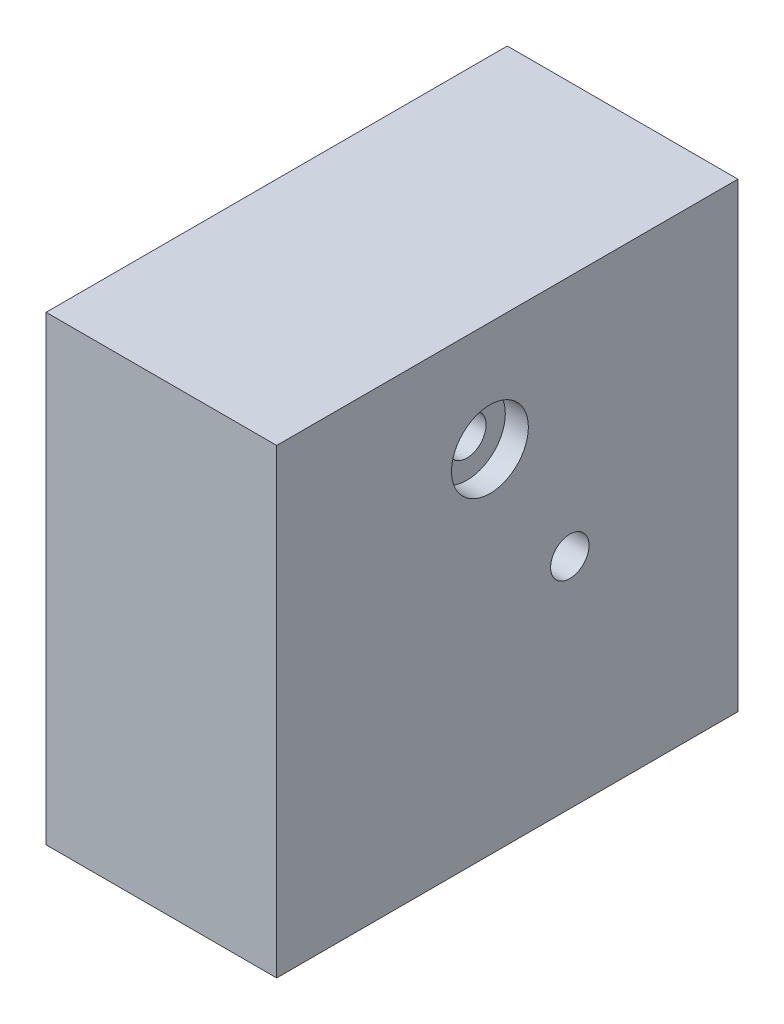
ISO-10303-21;
HEADER;
FILE_DESCRIPTION(('STEP AP214'),'2;1');
FILE_NAME('part.step','',(''),(''),'','','');
FILE_SCHEMA(('AUTOMOTIVE_DESIGN { 1 0 10303 214 1 1 1 1 }'));
ENDSEC;
DATA;
#1=APPLICATION_CONTEXT('core data for automotive mechanical design processes');
#2=APPLICATION_PROTOCOL_DEFINITION('international standard','automotive_design',2000,#1);
#3=PRODUCT_CONTEXT('',#1,'mechanical');
#4=PRODUCT('Part','Part','',(#3));
#5=PRODUCT_RELATED_PRODUCT_CATEGORY('part','',(#4));
#6=PRODUCT_DEFINITION_FORMATION('','',#4);
#7=PRODUCT_DEFINITION_CONTEXT('part definition',#1,'design');
#8=PRODUCT_DEFINITION('design','',#6,#7);
#9=PRODUCT_DEFINITION_SHAPE('','',#8);
#10=(LENGTH_UNIT() NAMED_UNIT(*) SI_UNIT(.MILLI.,.METRE.));
#11=(NAMED_UNIT(*) PLANE_ANGLE_UNIT() SI_UNIT($,.RADIAN.));
#12=(NAMED_UNIT(*) SI_UNIT($,.STERADIAN.) SOLID_ANGLE_UNIT());
#13=UNCERTAINTY_MEASURE_WITH_UNIT(LENGTH_MEASURE(1.E-05),#10,'distance_accuracy_value','');
#14=(GEOMETRIC_REPRESENTATION_CONTEXT(3) GLOBAL_UNCERTAINTY_ASSIGNED_CONTEXT((#13)) GLOBAL_UNIT_ASSIGNED_CONTEXT((#10,
#11,#12)) REPRESENTATION_CONTEXT('',''));
#15=CARTESIAN_POINT('',(0.,0.,0.));
#16=DIRECTION('',(0.,0.,1.));
#17=DIRECTION('',(1.,0.,0.));
#18=AXIS2_PLACEMENT_3D('',#15,#16,#17);
#19=CARTESIAN_POINT('',(-1.2E-05,85.7051553940905,122.259205921495));
#20=DIRECTION('',(1.,0.,0.));
#21=DIRECTION('',(0.,0.,-1.));
#22=AXIS2_PLACEMENT_3D('',#19,#20,#21);
#23=CYLINDRICAL_SURFACE('',#22,2.50000000000001);
#24=CARTESIAN_POINT('',(0.,85.7051553940905,122.259205921495));
#25=DIRECTION('',(1.,0.,0.));
#26=DIRECTION('',(0.,0.,-1.));
#27=AXIS2_PLACEMENT_3D('',#24,#25,#26);
#28=CIRCLE('',#27,2.50000000000001);
#29=CARTESIAN_POINT('',(0.,85.7051553940905,119.759205921495));
#30=VERTEX_POINT('',#29);
#31=EDGE_CURVE('E107',#30,#30,#28,.T.);
#32=CARTESIAN_POINT('',(27.,85.7051553940905,122.259205921495));
#33=DIRECTION('',(1.,0.,0.));
#34=DIRECTION('',(0.,0.,-1.));
#35=AXIS2_PLACEMENT_3D('',#32,#33,#34);
#36=CIRCLE('',#35,2.50000000000001);
#37=CARTESIAN_POINT('',(27.,85.7051553940905,119.759205921495));
#38=VERTEX_POINT('',#37);
#39=EDGE_CURVE('E41',#38,#38,#36,.F.);
#40=CARTESIAN_POINT('',(0.,85.7051553940905,119.759205921495));
#41=CARTESIAN_POINT('',(0.28125,85.7051553940905,119.759205921495));
#42=CARTESIAN_POINT('',(0.5625,85.7051553940905,119.759205921495));
#43=CARTESIAN_POINT('',(1.125,85.7051553940905,119.759205921495));
#44=CARTESIAN_POINT('',(1.40625,85.7051553940905,119.759205921495));
#45=CARTESIAN_POINT('',(1.96875,85.7051553940905,119.759205921495));
#46=CARTESIAN_POINT('',(2.25,85.7051553940905,119.759205921495));
#47=CARTESIAN_POINT('',(2.8125,85.7051553940905,119.759205921495));
#48=CARTESIAN_POINT('',(3.09375,85.7051553940905,119.759205921495));
#49=CARTESIAN_POINT('',(3.65625,85.7051553940905,119.759205921495));
#50=CARTESIAN_POINT('',(3.9375,85.7051553940905,119.759205921495));
#51=CARTESIAN_POINT('',(4.5,85.7051553940905,119.759205921495));
#52=CARTESIAN_POINT('',(4.78125,85.7051553940905,119.759205921495));
#53=CARTESIAN_POINT('',(5.34375,85.7051553940905,119.759205921495));
#54=CARTESIAN_POINT('',(5.625,85.7051553940905,119.759205921495));
#55=CARTESIAN_POINT('',(6.1875,85.7051553940905,119.759205921495));
#56=CARTESIAN_POINT('',(6.46875,85.7051553940905,119.759205921495));
#57=CARTESIAN_POINT('',(7.03125,85.7051553940905,119.759205921495));
#58=CARTESIAN_POINT('',(7.3125,85.7051553940905,119.759205921495));
#59=CARTESIAN_POINT('',(7.875,85.7051553940905,119.759205921495));
#60=CARTESIAN_POINT('',(8.15625,85.7051553940905,119.759205921495));
#61=CARTESIAN_POINT('',(8.71875,85.7051553940905,119.759205921495));
#62=CARTESIAN_POINT('',(9.,85.7051553940905,119.759205921495));
#63=CARTESIAN_POINT('',(9.5625,85.7051553940905,119.759205921495));
#64=CARTESIAN_POINT('',(9.84375,85.7051553940905,119.759205921495));
#65=CARTESIAN_POINT('',(10.40625,85.7051553940905,119.759205921495));
#66=CARTESIAN_POINT('',(10.6875,85.7051553940905,119.759205921495));
#67=CARTESIAN_POINT('',(11.25,85.7051553940905,119.759205921495));
#68=CARTESIAN_POINT('',(11.53125,85.7051553940905,119.759205921495));
#69=CARTESIAN_POINT('',(12.09375,85.7051553940905,119.759205921495));
#70=CARTESIAN_POINT('',(12.375,85.7051553940905,119.759205921495));
#71=CARTESIAN_POINT('',(12.9375,85.7051553940905,119.759205921495));
#72=CARTESIAN_POINT('',(13.21875,85.7051553940905,119.759205921495));
#73=CARTESIAN_POINT('',(13.78125,85.7051553940905,119.759205921495));
#74=CARTESIAN_POINT('',(14.0625,85.7051553940905,119.759205921495));
#75=CARTESIAN_POINT('',(14.625,85.7051553940905,119.759205921495));
#76=CARTESIAN_POINT('',(14.90625,85.7051553940905,119.759205921495));
#77=CARTESIAN_POINT('',(15.46875,85.7051553940905,119.759205921495));
#78=CARTESIAN_POINT('',(15.75,85.7051553940905,119.759205921495));
#79=CARTESIAN_POINT('',(16.3125,85.7051553940905,119.759205921495));
#80=CARTESIAN_POINT('',(16.59375,85.7051553940905,119.759205921495));
#81=CARTESIAN_POINT('',(17.15625,85.7051553940905,119.759205921495));
#82=CARTESIAN_POINT('',(17.4375,85.7051553940905,119.759205921495));
#83=CARTESIAN_POINT('',(18.,85.7051553940905,119.759205921495));
#84=CARTESIAN_POINT('',(18.28125,85.7051553940905,119.759205921495));
#85=CARTESIAN_POINT('',(18.84375,85.7051553940905,119.759205921495));
#86=CARTESIAN_POINT('',(19.125,85.7051553940905,119.759205921495));
#87=CARTESIAN_POINT('',(19.6875,85.7051553940905,119.759205921495));
#88=CARTESIAN_POINT('',(19.96875,85.7051553940905,119.759205921495));
#89=CARTESIAN_POINT('',(20.53125,85.7051553940905,119.759205921495));
#90=CARTESIAN_POINT('',(20.8125,85.7051553940905,119.759205921495));
#91=CARTESIAN_POINT('',(21.375,85.7051553940905,119.759205921495));
#92=CARTESIAN_POINT('',(21.65625,85.7051553940905,119.759205921495));
#93=CARTESIAN_POINT('',(22.21875,85.7051553940905,119.759205921495));
#94=CARTESIAN_POINT('',(22.5,85.7051553940905,119.759205921495));
#95=CARTESIAN_POINT('',(23.0625,85.7051553940905,119.759205921495));
#96=CARTESIAN_POINT('',(23.34375,85.7051553940905,119.759205921495));
#97=CARTESIAN_POINT('',(23.90625,85.7051553940905,119.759205921495));
#98=CARTESIAN_POINT('',(24.1875,85.7051553940905,119.759205921495));
#99=CARTESIAN_POINT('',(24.75,85.7051553940905,119.759205921495));
#100=CARTESIAN_POINT('',(25.03125,85.7051553940905,119.759205921495));
#101=CARTESIAN_POINT('',(25.59375,85.7051553940905,119.759205921495));
#102=CARTESIAN_POINT('',(25.875,85.7051553940905,119.759205921495));
#103=CARTESIAN_POINT('',(26.4375,85.7051553940905,119.759205921495));
#104=CARTESIAN_POINT('',(26.71875,85.7051553940905,119.759205921495));
#105=CARTESIAN_POINT('',(27.,85.7051553940905,119.759205921495));
#106=B_SPLINE_CURVE_WITH_KNOTS('',3,(#40,#41,#42,#43,#44,#45,#46,#47,#48,#49,#50,#51,#52,#53,
#54,#55,#56,#57,#58,#59,#60,#61,#62,#63,#64,#65,#66,#67,#68,#69,#70,#71,#72,#73,#74,#75,#76,#77,
#78,#79,#80,#81,#82,#83,#84,#85,#86,#87,#88,#89,#90,#91,#92,#93,#94,#95,#96,#97,#98,#99,#100,
#101,#102,#103,#104,#105),.UNSPECIFIED.,.F.,.F.,(4,2,2,2,2,2,2,2,2,2,2,2,2,2,2,2,2,2,2,2,2,2,2,
2,2,2,2,2,2,2,2,2,4),(0.,0.84375,1.6875,2.53125,3.375,4.21875,5.0625,5.90625,6.75,7.59375,
8.4375,9.28125,10.125,10.96875,11.8125,12.65625,13.5,14.34375,15.1875,16.03125,16.875,17.71875,
18.5625,19.40625,20.25,21.09375,21.9375,22.78125,23.625,24.46875,25.3125,26.15625,27.),.UNSPECIFIED.);
#107=EDGE_CURVE('BSEAM37',#30,#38,#106,.T.);
#108=ORIENTED_EDGE('',*,*,#31,.F.);
#109=ORIENTED_EDGE('',*,*,#39,.F.);
#110=ORIENTED_EDGE('',*,*,#107,.T.);
#111=ORIENTED_EDGE('',*,*,#107,.F.);
#112=EDGE_LOOP('',(#108,#110,#109,#111));
#113=FACE_BOUND('',#112,.T.);
#114=ADVANCED_FACE('F37',(#113),#23,.F.);
#115=CARTESIAN_POINT('',(-1.2E-05,68.4373066352128,111.869519883621));
#116=DIRECTION('',(1.,0.,0.));
#117=DIRECTION('',(0.,0.,-1.));
#118=AXIS2_PLACEMENT_3D('',#115,#116,#117);
#119=CYLINDRICAL_SURFACE('',#118,2.5);
#120=CARTESIAN_POINT('',(30.,68.4373066352128,111.869519883621));
#121=DIRECTION('',(1.,0.,0.));
#122=DIRECTION('',(0.,0.,-1.));
#123=AXIS2_PLACEMENT_3D('',#120,#121,#122);
#124=CIRCLE('',#123,2.5);
#125=CARTESIAN_POINT('',(30.,68.4373066352128,109.369519883621));
#126=VERTEX_POINT('',#125);
#127=EDGE_CURVE('E114',#126,#126,#124,.T.);
#128=CARTESIAN_POINT('',(3.,68.4373066352128,111.869519883621));
#129=DIRECTION('',(-1.,0.,0.));
#130=DIRECTION('',(0.,0.,1.));
#131=AXIS2_PLACEMENT_3D('',#128,#129,#130);
#132=CIRCLE('',#131,2.5);
#133=CARTESIAN_POINT('',(3.,68.4373066352128,109.369519883621));
#134=VERTEX_POINT('',#133);
#135=EDGE_CURVE('E115',#134,#134,#132,.F.);
#136=CARTESIAN_POINT('',(30.,68.4373066352128,109.369519883621));
#137=CARTESIAN_POINT('',(29.71875,68.4373066352128,109.369519883621));
#138=CARTESIAN_POINT('',(29.4375,68.4373066352128,109.369519883621));
#139=CARTESIAN_POINT('',(28.875,68.4373066352128,109.369519883621));
#140=CARTESIAN_POINT('',(28.59375,68.4373066352128,109.369519883621));
#141=CARTESIAN_POINT('',(28.03125,68.4373066352128,109.369519883621));
#142=CARTESIAN_POINT('',(27.75,68.4373066352128,109.369519883621));
#143=CARTESIAN_POINT('',(27.1875,68.4373066352128,109.369519883621));
#144=CARTESIAN_POINT('',(26.90625,68.4373066352128,109.369519883621));
#145=CARTESIAN_POINT('',(26.34375,68.4373066352128,109.369519883621));
#146=CARTESIAN_POINT('',(26.0625,68.4373066352128,109.369519883621));
#147=CARTESIAN_POINT('',(25.5,68.4373066352128,109.369519883621));
#148=CARTESIAN_POINT('',(25.21875,68.4373066352128,109.369519883621));
#149=CARTESIAN_POINT('',(24.65625,68.4373066352128,109.369519883621));
#150=CARTESIAN_POINT('',(24.375,68.4373066352128,109.369519883621));
#151=CARTESIAN_POINT('',(23.8125,68.4373066352128,109.369519883621));
#152=CARTESIAN_POINT('',(23.53125,68.4373066352128,109.369519883621));
#153=CARTESIAN_POINT('',(22.96875,68.4373066352128,109.369519883621));
#154=CARTESIAN_POINT('',(22.6875,68.4373066352128,109.369519883621));
#155=CARTESIAN_POINT('',(22.125,68.4373066352128,109.369519883621));
#156=CARTESIAN_POINT('',(21.84375,68.4373066352128,109.369519883621));
#157=CARTESIAN_POINT('',(21.28125,68.4373066352128,109.369519883621));
#158=CARTESIAN_POINT('',(21.,68.4373066352128,109.369519883621));
#159=CARTESIAN_POINT('',(20.4375,68.4373066352128,109.369519883621));
#160=CARTESIAN_POINT('',(20.15625,68.4373066352128,109.369519883621));
#161=CARTESIAN_POINT('',(19.59375,68.4373066352128,109.369519883621));
#162=CARTESIAN_POINT('',(19.3125,68.4373066352128,109.369519883621));
#163=CARTESIAN_POINT('',(18.75,68.4373066352128,109.369519883621));
#164=CARTESIAN_POINT('',(18.46875,68.4373066352128,109.369519883621));
#165=CARTESIAN_POINT('',(17.90625,68.4373066352128,109.369519883621));
#166=CARTESIAN_POINT('',(17.625,68.4373066352128,109.369519883621));
#167=CARTESIAN_POINT('',(17.0625,68.4373066352128,109.369519883621));
#168=CARTESIAN_POINT('',(16.78125,68.4373066352128,109.369519883621));
#169=CARTESIAN_POINT('',(16.21875,68.4373066352128,109.369519883621));
#170=CARTESIAN_POINT('',(15.9375,68.4373066352128,109.369519883621));
#171=CARTESIAN_POINT('',(15.375,68.4373066352128,109.369519883621));
#172=CARTESIAN_POINT('',(15.09375,68.4373066352128,109.369519883621));
#173=CARTESIAN_POINT('',(14.53125,68.4373066352128,109.369519883621));
#174=CARTESIAN_POINT('',(14.25,68.4373066352128,109.369519883621));
#175=CARTESIAN_POINT('',(13.6875,68.4373066352128,109.369519883621));
#176=CARTESIAN_POINT('',(13.40625,68.4373066352128,109.369519883621));
#177=CARTESIAN_POINT('',(12.84375,68.4373066352128,109.369519883621));
#178=CARTESIAN_POINT('',(12.5625,68.4373066352128,109.369519883621));
#179=CARTESIAN_POINT('',(12.,68.4373066352128,109.369519883621));
#180=CARTESIAN_POINT('',(11.71875,68.4373066352128,109.369519883621));
#181=CARTESIAN_POINT('',(11.15625,68.4373066352128,109.369519883621));
#182=CARTESIAN_POINT('',(10.875,68.4373066352128,109.369519883621));
#183=CARTESIAN_POINT('',(10.3125,68.4373066352128,109.369519883621));
#184=CARTESIAN_POINT('',(10.03125,68.4373066352128,109.369519883621));
#185=CARTESIAN_POINT('',(9.46875,68.4373066352128,109.369519883621));
#186=CARTESIAN_POINT('',(9.1875,68.4373066352128,109.369519883621));
#187=CARTESIAN_POINT('',(8.625,68.4373066352128,109.369519883621));
#188=CARTESIAN_POINT('',(8.34375,68.4373066352128,109.369519883621));
#189=CARTESIAN_POINT('',(7.78125,68.4373066352128,109.369519883621));
#190=CARTESIAN_POINT('',(7.5,68.4373066352128,109.369519883621));
#191=CARTESIAN_POINT('',(6.9375,68.4373066352128,109.369519883621));
#192=CARTESIAN_POINT('',(6.65625,68.4373066352128,109.369519883621));
#193=CARTESIAN_POINT('',(6.09375,68.4373066352128,109.369519883621));
#194=CARTESIAN_POINT('',(5.8125,68.4373066352128,109.369519883621));
#195=CARTESIAN_POINT('',(5.25,68.4373066352128,109.369519883621));
#196=CARTESIAN_POINT('',(4.96875,68.4373066352128,109.369519883621));
#197=CARTESIAN_POINT('',(4.40625,68.4373066352128,109.369519883621));
#198=CARTESIAN_POINT('',(4.125,68.4373066352128,109.369519883621));
#199=CARTESIAN_POINT('',(3.5625,68.4373066352128,109.369519883621));
#200=CARTESIAN_POINT('',(3.28125,68.4373066352128,109.369519883621));
#201=CARTESIAN_POINT('',(3.,68.4373066352128,109.369519883621));
#202=B_SPLINE_CURVE_WITH_KNOTS('',3,(#136,#137,#138,#139,#140,#141,#142,#143,#144,#145,#146,
#147,#148,#149,#150,#151,#152,#153,#154,#155,#156,#157,#158,#159,#160,#161,#162,#163,#164,#165,
#166,#167,#168,#169,#170,#171,#172,#173,#174,#175,#176,#177,#178,#179,#180,#181,#182,#183,#184,
#185,#186,#187,#188,#189,#190,#191,#192,#193,#194,#195,#196,#197,#198,#199,#200,#201),
.UNSPECIFIED.,.F.,.F.,(4,2,2,2,2,2,2,2,2,2,2,2,2,2,2,2,2,2,2,2,2,2,2,2,2,2,2,2,2,2,2,2,4),(0.,
0.843750000000001,1.6875,2.53125,3.375,4.21875,5.0625,5.90625,6.75,7.59375,8.4375,9.28125,
10.125,10.96875,11.8125,12.65625,13.5,14.34375,15.1875,16.03125,16.875,17.71875,18.5625,
19.40625,20.25,21.09375,21.9375,22.78125,23.625,24.46875,25.3125,26.15625,27.),.UNSPECIFIED.);
#203=EDGE_CURVE('BSEAM143',#126,#134,#202,.T.);
#204=ORIENTED_EDGE('',*,*,#127,.T.);
#205=ORIENTED_EDGE('',*,*,#135,.F.);
#206=ORIENTED_EDGE('',*,*,#203,.T.);
#207=ORIENTED_EDGE('',*,*,#203,.F.);
#208=EDGE_LOOP('',(#204,#206,#205,#207));
#209=FACE_BOUND('',#208,.T.);
#210=ADVANCED_FACE('F143',(#209),#119,.F.);
#211=CARTESIAN_POINT('',(30.,100.,90.));
#212=DIRECTION('',(0.,-1.,0.));
#213=DIRECTION('',(0.,0.,-1.));
#214=AXIS2_PLACEMENT_3D('',#211,#212,#213);
#215=PLANE('',#214);
#216=DIRECTION('',(0.,0.,1.));
#217=VECTOR('',#216,1.);
#218=CARTESIAN_POINT('',(0.,100.,90.));
#219=LINE('',#218,#217);
#220=CARTESIAN_POINT('',(0.,100.,90.));
#221=VERTEX_POINT('',#220);
#222=CARTESIAN_POINT('',(0.,100.,150.));
#223=VERTEX_POINT('',#222);
#224=EDGE_CURVE('E104',#221,#223,#219,.T.);
#225=ORIENTED_EDGE('',*,*,#224,.T.);
#226=DIRECTION('',(-1.,0.,0.));
#227=VECTOR('',#226,1.);
#228=CARTESIAN_POINT('',(30.,100.,150.));
#229=LINE('',#228,#227);
#230=CARTESIAN_POINT('',(30.,100.,150.));
#231=VERTEX_POINT('',#230);
#232=EDGE_CURVE('E11',#231,#223,#229,.T.);
#233=ORIENTED_EDGE('',*,*,#232,.F.);
#234=DIRECTION('',(0.,0.,1.));
#235=VECTOR('',#234,1.);
#236=CARTESIAN_POINT('',(30.,100.,90.));
#237=LINE('',#236,#235);
#238=CARTESIAN_POINT('',(30.,100.,90.));
#239=VERTEX_POINT('',#238);
#240=EDGE_CURVE('E91',#239,#231,#237,.T.);
#241=ORIENTED_EDGE('',*,*,#240,.F.);
#242=DIRECTION('',(-1.,0.,0.));
#243=VECTOR('',#242,1.);
#244=CARTESIAN_POINT('',(30.,100.,90.));
#245=LINE('',#244,#243);
#246=EDGE_CURVE('E100',#239,#221,#245,.T.);
#247=ORIENTED_EDGE('',*,*,#246,.T.);
#248=EDGE_LOOP('',(#225,#233,#241,#247));
#249=FACE_BOUND('',#248,.T.);
#250=ADVANCED_FACE('F39',(#249),#215,.F.);
#251=CARTESIAN_POINT('',(30.,100.,150.));
#252=DIRECTION('',(0.,0.,-1.));
#253=DIRECTION('',(0.,1.,0.));
#254=AXIS2_PLACEMENT_3D('',#251,#252,#253);
#255=PLANE('',#254);
#256=DIRECTION('',(0.,-1.,0.));
#257=VECTOR('',#256,1.);
#258=CARTESIAN_POINT('',(0.,100.,150.));
#259=LINE('',#258,#257);
#260=CARTESIAN_POINT('',(0.,40.,150.));
#261=VERTEX_POINT('',#260);
#262=EDGE_CURVE('E95',#223,#261,#259,.T.);
#263=ORIENTED_EDGE('',*,*,#262,.T.);
#264=DIRECTION('',(-1.,0.,0.));
#265=VECTOR('',#264,1.);
#266=CARTESIAN_POINT('',(30.,40.,150.));
#267=LINE('',#266,#265);
#268=CARTESIAN_POINT('',(30.,40.,150.));
#269=VERTEX_POINT('',#268);
#270=EDGE_CURVE('E47',#269,#261,#267,.T.);
#271=ORIENTED_EDGE('',*,*,#270,.F.);
#272=DIRECTION('',(0.,-1.,0.));
#273=VECTOR('',#272,1.);
#274=CARTESIAN_POINT('',(30.,100.,150.));
#275=LINE('',#274,#273);
#276=EDGE_CURVE('E86',#231,#269,#275,.T.);
#277=ORIENTED_EDGE('',*,*,#276,.F.);
#278=ORIENTED_EDGE('',*,*,#232,.T.);
#279=EDGE_LOOP('',(#263,#271,#277,#278));
#280=FACE_BOUND('',#279,.T.);
#281=ADVANCED_FACE('F94',(#280),#255,.F.);
#282=CARTESIAN_POINT('',(30.,40.,90.));
#283=DIRECTION('',(0.,1.,0.));
#284=DIRECTION('',(0.,0.,1.));
#285=AXIS2_PLACEMENT_3D('',#282,#283,#284);
#286=PLANE('',#285);
#287=DIRECTION('',(0.,0.,-1.));
#288=VECTOR('',#287,1.);
#289=CARTESIAN_POINT('',(0.,40.,90.));
#290=LINE('',#289,#288);
#291=CARTESIAN_POINT('',(0.,40.,90.));
#292=VERTEX_POINT('',#291);
#293=EDGE_CURVE('E73',#261,#292,#290,.T.);
#294=ORIENTED_EDGE('',*,*,#293,.T.);
#295=DIRECTION('',(-1.,0.,0.));
#296=VECTOR('',#295,1.);
#297=CARTESIAN_POINT('',(30.,40.,90.));
#298=LINE('',#297,#296);
#299=CARTESIAN_POINT('',(30.,40.,90.));
#300=VERTEX_POINT('',#299);
#301=EDGE_CURVE('E96',#300,#292,#298,.T.);
#302=ORIENTED_EDGE('',*,*,#301,.F.);
#303=DIRECTION('',(0.,0.,-1.));
#304=VECTOR('',#303,1.);
#305=CARTESIAN_POINT('',(30.,40.,90.));
#306=LINE('',#305,#304);
#307=EDGE_CURVE('E89',#269,#300,#306,.T.);
#308=ORIENTED_EDGE('',*,*,#307,.F.);
#309=ORIENTED_EDGE('',*,*,#270,.T.);
#310=EDGE_LOOP('',(#294,#302,#308,#309));
#311=FACE_BOUND('',#310,.T.);
#312=ADVANCED_FACE('F98',(#311),#286,.F.);
#313=CARTESIAN_POINT('',(30.,100.,90.));
#314=DIRECTION('',(0.,0.,1.));
#315=DIRECTION('',(0.,-1.,0.));
#316=AXIS2_PLACEMENT_3D('',#313,#314,#315);
#317=PLANE('',#316);
#318=DIRECTION('',(0.,1.,0.));
#319=VECTOR('',#318,1.);
#320=CARTESIAN_POINT('',(0.,100.,90.));
#321=LINE('',#320,#319);
#322=EDGE_CURVE('E79',#292,#221,#321,.T.);
#323=ORIENTED_EDGE('',*,*,#322,.T.);
#324=ORIENTED_EDGE('',*,*,#246,.F.);
#325=DIRECTION('',(0.,1.,0.));
#326=VECTOR('',#325,1.);
#327=CARTESIAN_POINT('',(30.,100.,90.));
#328=LINE('',#327,#326);
#329=EDGE_CURVE('E56',#300,#239,#328,.T.);
#330=ORIENTED_EDGE('',*,*,#329,.F.);
#331=ORIENTED_EDGE('',*,*,#301,.T.);
#332=EDGE_LOOP('',(#323,#324,#330,#331));
#333=FACE_BOUND('',#332,.T.);
#334=ADVANCED_FACE('F157',(#333),#317,.F.);
#335=CARTESIAN_POINT('',(30.,0.,0.));
#336=DIRECTION('',(1.,0.,0.));
#337=DIRECTION('',(0.,0.,-1.));
#338=AXIS2_PLACEMENT_3D('',#335,#336,#337);
#339=PLANE('',#338);
#340=CARTESIAN_POINT('',(30.,85.7051553940905,122.259205921495));
#341=DIRECTION('',(1.,0.,0.));
#342=DIRECTION('',(0.,0.,-1.));
#343=AXIS2_PLACEMENT_3D('',#340,#341,#342);
#344=CIRCLE('',#343,5.00000000000001);
#345=CARTESIAN_POINT('',(30.,85.7051553940905,117.259205921495));
#346=VERTEX_POINT('',#345);
#347=EDGE_CURVE('E130',#346,#346,#344,.T.);
#348=ORIENTED_EDGE('',*,*,#347,.F.);
#349=EDGE_LOOP('',(#348));
#350=FACE_BOUND('',#349,.T.);
#351=ORIENTED_EDGE('',*,*,#127,.F.);
#352=EDGE_LOOP('',(#351));
#353=FACE_BOUND('',#352,.T.);
#354=ORIENTED_EDGE('',*,*,#240,.T.);
#355=ORIENTED_EDGE('',*,*,#276,.T.);
#356=ORIENTED_EDGE('',*,*,#307,.T.);
#357=ORIENTED_EDGE('',*,*,#329,.T.);
#358=EDGE_LOOP('',(#354,#355,#356,#357));
#359=FACE_BOUND('',#358,.T.);
#360=ADVANCED_FACE('F87',(#350,#353,#359),#339,.T.);
#361=CARTESIAN_POINT('',(0.,0.,0.));
#362=DIRECTION('',(1.,0.,0.));
#363=DIRECTION('',(0.,0.,-1.));
#364=AXIS2_PLACEMENT_3D('',#361,#362,#363);
#365=PLANE('',#364);
#366=CARTESIAN_POINT('',(0.,68.4373066352128,111.869519883621));
#367=DIRECTION('',(-1.,0.,0.));
#368=DIRECTION('',(0.,0.,1.));
#369=AXIS2_PLACEMENT_3D('',#366,#367,#368);
#370=CIRCLE('',#369,5.00000000000001);
#371=CARTESIAN_POINT('',(0.,68.4373066352128,116.869519883621));
#372=VERTEX_POINT('',#371);
#373=EDGE_CURVE('E123',#372,#372,#370,.T.);
#374=ORIENTED_EDGE('',*,*,#373,.F.);
#375=EDGE_LOOP('',(#374));
#376=FACE_BOUND('',#375,.T.);
#377=ORIENTED_EDGE('',*,*,#31,.T.);
#378=EDGE_LOOP('',(#377));
#379=FACE_BOUND('',#378,.T.);
#380=ORIENTED_EDGE('',*,*,#224,.F.);
#381=ORIENTED_EDGE('',*,*,#322,.F.);
#382=ORIENTED_EDGE('',*,*,#293,.F.);
#383=ORIENTED_EDGE('',*,*,#262,.F.);
#384=EDGE_LOOP('',(#380,#381,#382,#383));
#385=FACE_BOUND('',#384,.T.);
#386=ADVANCED_FACE('F156',(#376,#379,#385),#365,.F.);
#387=CARTESIAN_POINT('',(3.,68.4373066352128,111.869519883621));
#388=DIRECTION('',(-1.,0.,0.));
#389=DIRECTION('',(0.,0.,1.));
#390=AXIS2_PLACEMENT_3D('',#387,#388,#389);
#391=PLANE('',#390);
#392=CARTESIAN_POINT('',(3.,68.4373066352128,111.869519883621));
#393=DIRECTION('',(-1.,0.,0.));
#394=DIRECTION('',(0.,0.,1.));
#395=AXIS2_PLACEMENT_3D('',#392,#393,#394);
#396=CIRCLE('',#395,5.00000000000001);
#397=CARTESIAN_POINT('',(3.,68.4373066352128,116.869519883621));
#398=VERTEX_POINT('',#397);
#399=EDGE_CURVE('E117',#398,#398,#396,.T.);
#400=ORIENTED_EDGE('',*,*,#399,.T.);
#401=EDGE_LOOP('',(#400));
#402=FACE_BOUND('',#401,.T.);
#403=ORIENTED_EDGE('',*,*,#135,.T.);
#404=EDGE_LOOP('',(#403));
#405=FACE_BOUND('',#404,.T.);
#406=ADVANCED_FACE('F161',(#402,#405),#391,.T.);
#407=CARTESIAN_POINT('',(3.,68.4373066352128,111.869519883621));
#408=DIRECTION('',(-1.,0.,0.));
#409=DIRECTION('',(0.,0.,1.));
#410=AXIS2_PLACEMENT_3D('',#407,#408,#409);
#411=CYLINDRICAL_SURFACE('',#410,5.00000000000001);
#412=ORIENTED_EDGE('',*,*,#399,.F.);
#413=EDGE_LOOP('',(#412));
#414=FACE_BOUND('',#413,.T.);
#415=ORIENTED_EDGE('',*,*,#373,.T.);
#416=EDGE_LOOP('',(#415));
#417=FACE_BOUND('',#416,.T.);
#418=ADVANCED_FACE('F199',(#414,#417),#411,.F.);
#419=CARTESIAN_POINT('',(27.,85.7051553940905,122.259205921495));
#420=DIRECTION('',(1.,0.,0.));
#421=DIRECTION('',(0.,0.,-1.));
#422=AXIS2_PLACEMENT_3D('',#419,#420,#421);
#423=PLANE('',#422);
#424=CARTESIAN_POINT('',(27.,85.7051553940905,122.259205921495));
#425=DIRECTION('',(1.,0.,0.));
#426=DIRECTION('',(0.,0.,-1.));
#427=AXIS2_PLACEMENT_3D('',#424,#425,#426);
#428=CIRCLE('',#427,5.00000000000001);
#429=CARTESIAN_POINT('',(27.,85.7051553940905,117.259205921495));
#430=VERTEX_POINT('',#429);
#431=EDGE_CURVE('E133',#430,#430,#428,.T.);
#432=ORIENTED_EDGE('',*,*,#431,.T.);
#433=EDGE_LOOP('',(#432));
#434=FACE_BOUND('',#433,.T.);
#435=ORIENTED_EDGE('',*,*,#39,.T.);
#436=EDGE_LOOP('',(#435));
#437=FACE_BOUND('',#436,.T.);
#438=ADVANCED_FACE('F140',(#434,#437),#423,.T.);
#439=CARTESIAN_POINT('',(27.,85.7051553940905,122.259205921495));
#440=DIRECTION('',(1.,0.,0.));
#441=DIRECTION('',(0.,0.,-1.));
#442=AXIS2_PLACEMENT_3D('',#439,#440,#441);
#443=CYLINDRICAL_SURFACE('',#442,5.00000000000001);
#444=ORIENTED_EDGE('',*,*,#431,.F.);
#445=EDGE_LOOP('',(#444));
#446=FACE_BOUND('',#445,.T.);
#447=ORIENTED_EDGE('',*,*,#347,.T.);
#448=EDGE_LOOP('',(#447));
#449=FACE_BOUND('',#448,.T.);
#450=ADVANCED_FACE('F225',(#446,#449),#443,.F.);
#451=CLOSED_SHELL('',(#114,#210,#250,#281,#312,#334,#360,#386,#406,#418,#438,#450));
#452=MANIFOLD_SOLID_BREP('B2',#451);
#453=ADVANCED_BREP_SHAPE_REPRESENTATION('',(#18,#452),#14);
#454=SHAPE_DEFINITION_REPRESENTATION(#9,#453);
ENDSEC;
END-ISO-10303-21;
